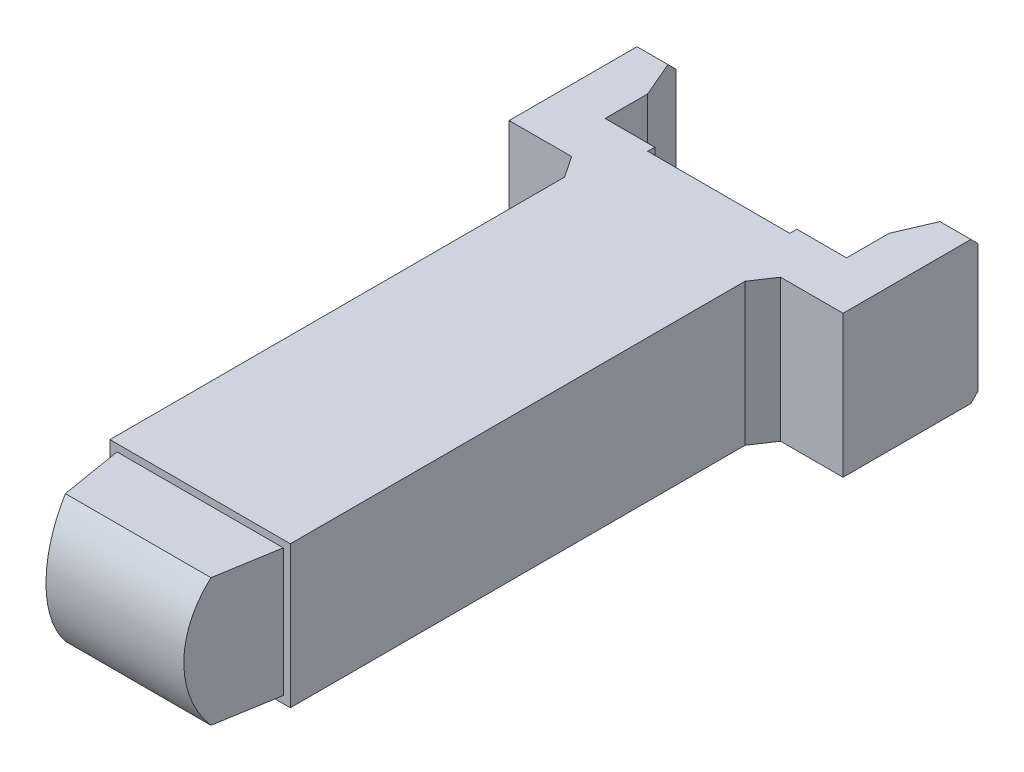
ISO-10303-21;
HEADER;
FILE_DESCRIPTION(('STEP AP214'),'2;1');
FILE_NAME('part.step','',(''),(''),'','','');
FILE_SCHEMA(('AUTOMOTIVE_DESIGN { 1 0 10303 214 1 1 1 1 }'));
ENDSEC;
DATA;
#1=APPLICATION_CONTEXT('core data for automotive mechanical design processes');
#2=APPLICATION_PROTOCOL_DEFINITION('international standard','automotive_design',2000,#1);
#3=PRODUCT_CONTEXT('',#1,'mechanical');
#4=PRODUCT('Part','Part','',(#3));
#5=PRODUCT_RELATED_PRODUCT_CATEGORY('part','',(#4));
#6=PRODUCT_DEFINITION_FORMATION('','',#4);
#7=PRODUCT_DEFINITION_CONTEXT('part definition',#1,'design');
#8=PRODUCT_DEFINITION('design','',#6,#7);
#9=PRODUCT_DEFINITION_SHAPE('','',#8);
#10=(LENGTH_UNIT() NAMED_UNIT(*) SI_UNIT(.MILLI.,.METRE.));
#11=(NAMED_UNIT(*) PLANE_ANGLE_UNIT() SI_UNIT($,.RADIAN.));
#12=(NAMED_UNIT(*) SI_UNIT($,.STERADIAN.) SOLID_ANGLE_UNIT());
#13=UNCERTAINTY_MEASURE_WITH_UNIT(LENGTH_MEASURE(1.E-05),#10,'distance_accuracy_value','');
#14=(GEOMETRIC_REPRESENTATION_CONTEXT(3) GLOBAL_UNCERTAINTY_ASSIGNED_CONTEXT((#13)) GLOBAL_UNIT_ASSIGNED_CONTEXT((#10,
#11,#12)) REPRESENTATION_CONTEXT('',''));
#15=CARTESIAN_POINT('',(0.,0.,0.));
#16=DIRECTION('',(0.,0.,1.));
#17=DIRECTION('',(1.,0.,0.));
#18=AXIS2_PLACEMENT_3D('',#15,#16,#17);
#19=CARTESIAN_POINT('',(-0.635,0.,3.25));
#20=DIRECTION('',(-1.,0.,0.));
#21=DIRECTION('',(0.,0.,1.));
#22=AXIS2_PLACEMENT_3D('',#19,#20,#21);
#23=CYLINDRICAL_SURFACE('',#22,0.7);
#24=CARTESIAN_POINT('',(0.601666666666666,0.,3.25));
#25=DIRECTION('',(0.986393923832144,0.,0.164398987305357));
#26=DIRECTION('',(-0.164398987305357,0.,0.986393923832144));
#27=AXIS2_PLACEMENT_3D('',#24,#25,#26);
#28=ELLIPSE('',#27,0.709655628534792,0.7);
#29=CARTESIAN_POINT('',(0.512301622543637,0.45,3.78619026473818));
#30=VERTEX_POINT('',#29);
#31=CARTESIAN_POINT('',(0.512301622543637,-0.45,3.78619026473818));
#32=VERTEX_POINT('',#31);
#33=EDGE_CURVE('E20',#30,#32,#28,.T.);
#34=ORIENTED_EDGE('',*,*,#33,.F.);
#35=DIRECTION('',(1.,0.,0.));
#36=VECTOR('',#35,1.);
#37=CARTESIAN_POINT('',(-0.635,0.45,3.78619026473818));
#38=LINE('',#37,#36);
#39=CARTESIAN_POINT('',(-0.512301622543637,0.45,3.78619026473818));
#40=VERTEX_POINT('',#39);
#41=EDGE_CURVE('E214',#30,#40,#38,.F.);
#42=ORIENTED_EDGE('',*,*,#41,.T.);
#43=CARTESIAN_POINT('',(-0.601666666666666,0.,3.25));
#44=DIRECTION('',(-0.986393923832144,0.,0.164398987305357));
#45=DIRECTION('',(-0.164398987305357,0.,-0.986393923832144));
#46=AXIS2_PLACEMENT_3D('',#43,#44,#45);
#47=ELLIPSE('',#46,0.709655628534792,0.7);
#48=CARTESIAN_POINT('',(-0.512301622543637,-0.45,3.78619026473818));
#49=VERTEX_POINT('',#48);
#50=EDGE_CURVE('E228',#49,#40,#47,.T.);
#51=ORIENTED_EDGE('',*,*,#50,.F.);
#52=DIRECTION('',(1.,0.,0.));
#53=VECTOR('',#52,1.);
#54=CARTESIAN_POINT('',(-0.635,-0.45,3.78619026473818));
#55=LINE('',#54,#53);
#56=EDGE_CURVE('E216',#49,#32,#55,.T.);
#57=ORIENTED_EDGE('',*,*,#56,.T.);
#58=EDGE_LOOP('',(#34,#42,#51,#57));
#59=FACE_BOUND('',#58,.T.);
#60=ADVANCED_FACE('F17',(#59),#23,.T.);
#61=CARTESIAN_POINT('',(-1.175,-0.5,-1.));
#62=DIRECTION('',(0.,0.,-1.));
#63=DIRECTION('',(-1.,0.,0.));
#64=AXIS2_PLACEMENT_3D('',#61,#62,#63);
#65=PLANE('',#64);
#66=DIRECTION('',(0.,1.,0.));
#67=VECTOR('',#66,1.);
#68=CARTESIAN_POINT('',(-1.125,-0.5,-1.));
#69=LINE('',#68,#67);
#70=CARTESIAN_POINT('',(-1.125,-0.4,-1.));
#71=VERTEX_POINT('',#70);
#72=CARTESIAN_POINT('',(-1.125,0.4,-1.));
#73=VERTEX_POINT('',#72);
#74=EDGE_CURVE('E237',#71,#73,#69,.T.);
#75=ORIENTED_EDGE('',*,*,#74,.T.);
#76=DIRECTION('',(1.,0.,0.));
#77=VECTOR('',#76,1.);
#78=CARTESIAN_POINT('',(-1.175,0.4,-1.));
#79=LINE('',#78,#77);
#80=CARTESIAN_POINT('',(-1.,0.4,-1.));
#81=VERTEX_POINT('',#80);
#82=EDGE_CURVE('E287',#73,#81,#79,.T.);
#83=ORIENTED_EDGE('',*,*,#82,.T.);
#84=DIRECTION('',(0.,1.,0.));
#85=VECTOR('',#84,1.);
#86=CARTESIAN_POINT('',(-1.,-0.5,-1.));
#87=LINE('',#86,#85);
#88=CARTESIAN_POINT('',(-1.,-0.4,-1.));
#89=VERTEX_POINT('',#88);
#90=EDGE_CURVE('E297',#89,#81,#87,.T.);
#91=ORIENTED_EDGE('',*,*,#90,.F.);
#92=DIRECTION('',(1.,0.,0.));
#93=VECTOR('',#92,1.);
#94=CARTESIAN_POINT('',(-1.175,-0.4,-1.));
#95=LINE('',#94,#93);
#96=EDGE_CURVE('E219',#71,#89,#95,.T.);
#97=ORIENTED_EDGE('',*,*,#96,.F.);
#98=EDGE_LOOP('',(#75,#83,#91,#97));
#99=FACE_BOUND('',#98,.T.);
#100=ADVANCED_FACE('F284',(#99),#65,.T.);
#101=CARTESIAN_POINT('',(-1.125,-0.5,-1.));
#102=DIRECTION('',(0.707106781186548,0.,0.707106781186547));
#103=DIRECTION('',(0.707106781186547,0.,-0.707106781186548));
#104=AXIS2_PLACEMENT_3D('',#101,#102,#103);
#105=PLANE('',#104);
#106=DIRECTION('',(0.577350269189625,0.577350269189626,-0.577350269189626));
#107=VECTOR('',#106,1.);
#108=CARTESIAN_POINT('',(-1.175,-0.45,-0.95));
#109=LINE('',#108,#107);
#110=CARTESIAN_POINT('',(-1.175,-0.45,-0.95));
#111=VERTEX_POINT('',#110);
#112=EDGE_CURVE('E277',#111,#71,#109,.T.);
#113=ORIENTED_EDGE('',*,*,#112,.F.);
#114=DIRECTION('',(0.,1.,0.));
#115=VECTOR('',#114,1.);
#116=CARTESIAN_POINT('',(-1.175,-0.5,-0.95));
#117=LINE('',#116,#115);
#118=CARTESIAN_POINT('',(-1.175,0.45,-0.95));
#119=VERTEX_POINT('',#118);
#120=EDGE_CURVE('E294',#119,#111,#117,.F.);
#121=ORIENTED_EDGE('',*,*,#120,.F.);
#122=DIRECTION('',(0.577350269189625,-0.577350269189626,-0.577350269189626));
#123=VECTOR('',#122,1.);
#124=CARTESIAN_POINT('',(-1.175,0.45,-0.95));
#125=LINE('',#124,#123);
#126=EDGE_CURVE('E291',#119,#73,#125,.T.);
#127=ORIENTED_EDGE('',*,*,#126,.T.);
#128=ORIENTED_EDGE('',*,*,#74,.F.);
#129=EDGE_LOOP('',(#113,#121,#127,#128));
#130=FACE_BOUND('',#129,.T.);
#131=ADVANCED_FACE('F292',(#130),#105,.F.);
#132=CARTESIAN_POINT('',(-1.175,-0.4,-1.));
#133=DIRECTION('',(0.,-0.707106781186548,-0.707106781186547));
#134=DIRECTION('',(0.,0.707106781186547,-0.707106781186548));
#135=AXIS2_PLACEMENT_3D('',#132,#133,#134);
#136=PLANE('',#135);
#137=ORIENTED_EDGE('',*,*,#112,.T.);
#138=ORIENTED_EDGE('',*,*,#96,.T.);
#139=DIRECTION('',(-0.290020946713699,0.676715542331965,-0.676715542331964));
#140=VECTOR('',#139,1.);
#141=CARTESIAN_POINT('',(-0.957142857142857,-0.5,-0.9));
#142=LINE('',#141,#140);
#143=CARTESIAN_POINT('',(-0.957142857142857,-0.5,-0.9));
#144=VERTEX_POINT('',#143);
#145=EDGE_CURVE('E308',#144,#89,#142,.T.);
#146=ORIENTED_EDGE('',*,*,#145,.F.);
#147=DIRECTION('',(1.,0.,0.));
#148=VECTOR('',#147,1.);
#149=CARTESIAN_POINT('',(-1.175,-0.5,-0.9));
#150=LINE('',#149,#148);
#151=CARTESIAN_POINT('',(-1.175,-0.5,-0.9));
#152=VERTEX_POINT('',#151);
#153=EDGE_CURVE('E324',#144,#152,#150,.F.);
#154=ORIENTED_EDGE('',*,*,#153,.T.);
#155=DIRECTION('',(0.,-0.707106781186548,0.707106781186547));
#156=VECTOR('',#155,1.);
#157=CARTESIAN_POINT('',(-1.175,-0.45,-0.95));
#158=LINE('',#157,#156);
#159=EDGE_CURVE('E412',#111,#152,#158,.T.);
#160=ORIENTED_EDGE('',*,*,#159,.F.);
#161=EDGE_LOOP('',(#137,#138,#146,#154,#160));
#162=FACE_BOUND('',#161,.T.);
#163=ADVANCED_FACE('F532',(#162),#136,.T.);
#164=CARTESIAN_POINT('',(0.485,-0.5,3.95));
#165=DIRECTION('',(0.986393923832144,0.,0.164398987305357));
#166=DIRECTION('',(0.164398987305357,0.,-0.986393923832144));
#167=AXIS2_PLACEMENT_3D('',#164,#165,#166);
#168=PLANE('',#167);
#169=DIRECTION('',(-0.164398987305357,0.,0.986393923832144));
#170=VECTOR('',#169,1.);
#171=CARTESIAN_POINT('',(0.585,0.45,3.35));
#172=LINE('',#171,#170);
#173=CARTESIAN_POINT('',(0.585,0.45,3.35));
#174=VERTEX_POINT('',#173);
#175=EDGE_CURVE('E221',#174,#30,#172,.T.);
#176=ORIENTED_EDGE('',*,*,#175,.T.);
#177=ORIENTED_EDGE('',*,*,#33,.T.);
#178=DIRECTION('',(0.164398987305357,0.,-0.986393923832144));
#179=VECTOR('',#178,1.);
#180=CARTESIAN_POINT('',(0.512301622543637,-0.45,3.78619026473818));
#181=LINE('',#180,#179);
#182=CARTESIAN_POINT('',(0.585,-0.45,3.35));
#183=VERTEX_POINT('',#182);
#184=EDGE_CURVE('E260',#32,#183,#181,.T.);
#185=ORIENTED_EDGE('',*,*,#184,.T.);
#186=DIRECTION('',(0.,1.,0.));
#187=VECTOR('',#186,1.);
#188=CARTESIAN_POINT('',(0.585,-0.5,3.35));
#189=LINE('',#188,#187);
#190=EDGE_CURVE('E224',#174,#183,#189,.F.);
#191=ORIENTED_EDGE('',*,*,#190,.F.);
#192=EDGE_LOOP('',(#176,#177,#185,#191));
#193=FACE_BOUND('',#192,.T.);
#194=ADVANCED_FACE('F222',(#193),#168,.T.);
#195=CARTESIAN_POINT('',(-0.635,-0.45,3.78619026473818));
#196=DIRECTION('',(0.,1.,0.));
#197=DIRECTION('',(0.,0.,1.));
#198=AXIS2_PLACEMENT_3D('',#195,#196,#197);
#199=PLANE('',#198);
#200=DIRECTION('',(1.,0.,0.));
#201=VECTOR('',#200,1.);
#202=CARTESIAN_POINT('',(0.585,-0.45,3.35));
#203=LINE('',#202,#201);
#204=CARTESIAN_POINT('',(-0.585,-0.45,3.35));
#205=VERTEX_POINT('',#204);
#206=EDGE_CURVE('E250',#183,#205,#203,.F.);
#207=ORIENTED_EDGE('',*,*,#206,.F.);
#208=ORIENTED_EDGE('',*,*,#184,.F.);
#209=ORIENTED_EDGE('',*,*,#56,.F.);
#210=DIRECTION('',(0.164398987305357,0.,0.986393923832144));
#211=VECTOR('',#210,1.);
#212=CARTESIAN_POINT('',(-0.485,-0.45,3.95));
#213=LINE('',#212,#211);
#214=EDGE_CURVE('E266',#205,#49,#213,.T.);
#215=ORIENTED_EDGE('',*,*,#214,.F.);
#216=EDGE_LOOP('',(#207,#208,#209,#215));
#217=FACE_BOUND('',#216,.T.);
#218=ADVANCED_FACE('F780',(#217),#199,.F.);
#219=CARTESIAN_POINT('',(-0.485,-0.5,3.95));
#220=DIRECTION('',(-0.986393923832144,0.,0.164398987305357));
#221=DIRECTION('',(0.164398987305357,0.,0.986393923832144));
#222=AXIS2_PLACEMENT_3D('',#219,#220,#221);
#223=PLANE('',#222);
#224=DIRECTION('',(-0.164398987305357,0.,-0.986393923832144));
#225=VECTOR('',#224,1.);
#226=CARTESIAN_POINT('',(-0.512301622543637,0.45,3.78619026473818));
#227=LINE('',#226,#225);
#228=CARTESIAN_POINT('',(-0.585,0.45,3.35));
#229=VERTEX_POINT('',#228);
#230=EDGE_CURVE('E232',#40,#229,#227,.T.);
#231=ORIENTED_EDGE('',*,*,#230,.T.);
#232=DIRECTION('',(0.,1.,0.));
#233=VECTOR('',#232,1.);
#234=CARTESIAN_POINT('',(-0.585,-0.5,3.35));
#235=LINE('',#234,#233);
#236=EDGE_CURVE('E245',#205,#229,#235,.T.);
#237=ORIENTED_EDGE('',*,*,#236,.F.);
#238=ORIENTED_EDGE('',*,*,#214,.T.);
#239=ORIENTED_EDGE('',*,*,#50,.T.);
#240=EDGE_LOOP('',(#231,#237,#238,#239));
#241=FACE_BOUND('',#240,.T.);
#242=ADVANCED_FACE('F772',(#241),#223,.T.);
#243=CARTESIAN_POINT('',(-0.635,0.45,3.78619026473818));
#244=DIRECTION('',(0.,-1.,0.));
#245=DIRECTION('',(0.,0.,-1.));
#246=AXIS2_PLACEMENT_3D('',#243,#244,#245);
#247=PLANE('',#246);
#248=ORIENTED_EDGE('',*,*,#41,.F.);
#249=ORIENTED_EDGE('',*,*,#175,.F.);
#250=DIRECTION('',(1.,0.,0.));
#251=VECTOR('',#250,1.);
#252=CARTESIAN_POINT('',(0.585,0.45,3.35));
#253=LINE('',#252,#251);
#254=EDGE_CURVE('E242',#229,#174,#253,.T.);
#255=ORIENTED_EDGE('',*,*,#254,.F.);
#256=ORIENTED_EDGE('',*,*,#230,.F.);
#257=EDGE_LOOP('',(#248,#249,#255,#256));
#258=FACE_BOUND('',#257,.T.);
#259=ADVANCED_FACE('F231',(#258),#247,.F.);
#260=CARTESIAN_POINT('',(-1.175,-0.5,0.));
#261=DIRECTION('',(0.,1.,0.));
#262=DIRECTION('',(0.,0.,1.));
#263=AXIS2_PLACEMENT_3D('',#260,#261,#262);
#264=PLANE('',#263);
#265=ORIENTED_EDGE('',*,*,#153,.F.);
#266=DIRECTION('',(-0.393919298579168,0.,-0.919145030018058));
#267=VECTOR('',#266,1.);
#268=CARTESIAN_POINT('',(-0.85,-0.5,-0.65));
#269=LINE('',#268,#267);
#270=CARTESIAN_POINT('',(-0.85,-0.5,-0.65));
#271=VERTEX_POINT('',#270);
#272=EDGE_CURVE('E311',#271,#144,#269,.T.);
#273=ORIENTED_EDGE('',*,*,#272,.F.);
#274=DIRECTION('',(0.,0.,1.));
#275=VECTOR('',#274,1.);
#276=CARTESIAN_POINT('',(-0.85,-0.5,0.));
#277=LINE('',#276,#275);
#278=CARTESIAN_POINT('',(-0.85,-0.5,-0.35));
#279=VERTEX_POINT('',#278);
#280=EDGE_CURVE('E326',#279,#271,#277,.F.);
#281=ORIENTED_EDGE('',*,*,#280,.F.);
#282=DIRECTION('',(1.,0.,0.));
#283=VECTOR('',#282,1.);
#284=CARTESIAN_POINT('',(-1.175,-0.5,-0.35));
#285=LINE('',#284,#283);
#286=CARTESIAN_POINT('',(-0.5,-0.5,-0.35));
#287=VERTEX_POINT('',#286);
#288=EDGE_CURVE('E328',#287,#279,#285,.F.);
#289=ORIENTED_EDGE('',*,*,#288,.F.);
#290=DIRECTION('',(0.,0.,1.));
#291=VECTOR('',#290,1.);
#292=CARTESIAN_POINT('',(-0.5,-0.5,0.));
#293=LINE('',#292,#291);
#294=CARTESIAN_POINT('',(-0.5,-0.5,-0.3));
#295=VERTEX_POINT('',#294);
#296=EDGE_CURVE('E330',#295,#287,#293,.F.);
#297=ORIENTED_EDGE('',*,*,#296,.F.);
#298=DIRECTION('',(1.,0.,0.));
#299=VECTOR('',#298,1.);
#300=CARTESIAN_POINT('',(-1.175,-0.5,-0.3));
#301=LINE('',#300,#299);
#302=CARTESIAN_POINT('',(0.5,-0.5,-0.3));
#303=VERTEX_POINT('',#302);
#304=EDGE_CURVE('E332',#303,#295,#301,.F.);
#305=ORIENTED_EDGE('',*,*,#304,.F.);
#306=DIRECTION('',(0.,0.,1.));
#307=VECTOR('',#306,1.);
#308=CARTESIAN_POINT('',(0.5,-0.5,0.));
#309=LINE('',#308,#307);
#310=CARTESIAN_POINT('',(0.5,-0.5,-0.35));
#311=VERTEX_POINT('',#310);
#312=EDGE_CURVE('E334',#311,#303,#309,.T.);
#313=ORIENTED_EDGE('',*,*,#312,.F.);
#314=DIRECTION('',(1.,0.,0.));
#315=VECTOR('',#314,1.);
#316=CARTESIAN_POINT('',(-1.175,-0.5,-0.35));
#317=LINE('',#316,#315);
#318=CARTESIAN_POINT('',(0.85,-0.5,-0.35));
#319=VERTEX_POINT('',#318);
#320=EDGE_CURVE('E336',#319,#311,#317,.F.);
#321=ORIENTED_EDGE('',*,*,#320,.F.);
#322=DIRECTION('',(0.,0.,1.));
#323=VECTOR('',#322,1.);
#324=CARTESIAN_POINT('',(0.85,-0.5,0.));
#325=LINE('',#324,#323);
#326=CARTESIAN_POINT('',(0.85,-0.5,-0.65));
#327=VERTEX_POINT('',#326);
#328=EDGE_CURVE('E338',#327,#319,#325,.T.);
#329=ORIENTED_EDGE('',*,*,#328,.F.);
#330=DIRECTION('',(-0.393919298579168,0.,0.919145030018058));
#331=VECTOR('',#330,1.);
#332=CARTESIAN_POINT('',(0.957142857142857,-0.5,-0.9));
#333=LINE('',#332,#331);
#334=CARTESIAN_POINT('',(0.957142857142857,-0.5,-0.9));
#335=VERTEX_POINT('',#334);
#336=EDGE_CURVE('E340',#335,#327,#333,.T.);
#337=ORIENTED_EDGE('',*,*,#336,.F.);
#338=DIRECTION('',(1.,0.,0.));
#339=VECTOR('',#338,1.);
#340=CARTESIAN_POINT('',(1.,-0.5,-0.9));
#341=LINE('',#340,#339);
#342=CARTESIAN_POINT('',(1.175,-0.5,-0.9));
#343=VERTEX_POINT('',#342);
#344=EDGE_CURVE('E319',#343,#335,#341,.F.);
#345=ORIENTED_EDGE('',*,*,#344,.F.);
#346=DIRECTION('',(0.,0.,1.));
#347=VECTOR('',#346,1.);
#348=CARTESIAN_POINT('',(1.175,-0.5,0.));
#349=LINE('',#348,#347);
#350=CARTESIAN_POINT('',(1.175,-0.5,0.));
#351=VERTEX_POINT('',#350);
#352=EDGE_CURVE('E342',#351,#343,#349,.F.);
#353=ORIENTED_EDGE('',*,*,#352,.F.);
#354=DIRECTION('',(1.,0.,0.));
#355=VECTOR('',#354,1.);
#356=CARTESIAN_POINT('',(-1.175,-0.5,0.));
#357=LINE('',#356,#355);
#358=CARTESIAN_POINT('',(0.735,-0.5,0.));
#359=VERTEX_POINT('',#358);
#360=EDGE_CURVE('E343',#359,#351,#357,.T.);
#361=ORIENTED_EDGE('',*,*,#360,.F.);
#362=DIRECTION('',(0.554700196225229,0.,-0.832050294337844));
#363=VECTOR('',#362,1.);
#364=CARTESIAN_POINT('',(0.635,-0.5,0.15));
#365=LINE('',#364,#363);
#366=CARTESIAN_POINT('',(0.635,-0.5,0.15));
#367=VERTEX_POINT('',#366);
#368=EDGE_CURVE('E234',#367,#359,#365,.T.);
#369=ORIENTED_EDGE('',*,*,#368,.F.);
#370=DIRECTION('',(0.,0.,-1.));
#371=VECTOR('',#370,1.);
#372=CARTESIAN_POINT('',(0.635,-0.5,3.35));
#373=LINE('',#372,#371);
#374=CARTESIAN_POINT('',(0.635,-0.5,3.35));
#375=VERTEX_POINT('',#374);
#376=EDGE_CURVE('E385',#375,#367,#373,.T.);
#377=ORIENTED_EDGE('',*,*,#376,.F.);
#378=DIRECTION('',(1.,0.,0.));
#379=VECTOR('',#378,1.);
#380=CARTESIAN_POINT('',(0.585,-0.5,3.35));
#381=LINE('',#380,#379);
#382=CARTESIAN_POINT('',(-0.635,-0.5,3.35));
#383=VERTEX_POINT('',#382);
#384=EDGE_CURVE('E256',#383,#375,#381,.T.);
#385=ORIENTED_EDGE('',*,*,#384,.F.);
#386=DIRECTION('',(0.,0.,1.));
#387=VECTOR('',#386,1.);
#388=CARTESIAN_POINT('',(-0.635,-0.5,3.35));
#389=LINE('',#388,#387);
#390=CARTESIAN_POINT('',(-0.635,-0.5,0.15));
#391=VERTEX_POINT('',#390);
#392=EDGE_CURVE('E393',#391,#383,#389,.T.);
#393=ORIENTED_EDGE('',*,*,#392,.F.);
#394=DIRECTION('',(0.55470019622523,0.,0.832050294337843));
#395=VECTOR('',#394,1.);
#396=CARTESIAN_POINT('',(-0.735,-0.5,0.));
#397=LINE('',#396,#395);
#398=CARTESIAN_POINT('',(-0.735,-0.5,0.));
#399=VERTEX_POINT('',#398);
#400=EDGE_CURVE('E398',#399,#391,#397,.T.);
#401=ORIENTED_EDGE('',*,*,#400,.F.);
#402=DIRECTION('',(1.,0.,0.));
#403=VECTOR('',#402,1.);
#404=CARTESIAN_POINT('',(-1.175,-0.5,0.));
#405=LINE('',#404,#403);
#406=CARTESIAN_POINT('',(-1.175,-0.5,0.));
#407=VERTEX_POINT('',#406);
#408=EDGE_CURVE('E403',#407,#399,#405,.T.);
#409=ORIENTED_EDGE('',*,*,#408,.F.);
#410=DIRECTION('',(0.,0.,1.));
#411=VECTOR('',#410,1.);
#412=CARTESIAN_POINT('',(-1.175,-0.5,0.));
#413=LINE('',#412,#411);
#414=EDGE_CURVE('E410',#152,#407,#413,.T.);
#415=ORIENTED_EDGE('',*,*,#414,.F.);
#416=EDGE_LOOP('',(#265,#273,#281,#289,#297,#305,#313,#321,#329,#337,#345,#353,#361,#369,#377,
#385,#393,#401,#409,#415));
#417=FACE_BOUND('',#416,.T.);
#418=ADVANCED_FACE('F365',(#417),#264,.F.);
#419=CARTESIAN_POINT('',(1.175,-0.5,-0.95));
#420=DIRECTION('',(-0.707106781186548,0.,0.707106781186547));
#421=DIRECTION('',(0.707106781186547,0.,0.707106781186548));
#422=AXIS2_PLACEMENT_3D('',#419,#420,#421);
#423=PLANE('',#422);
#424=DIRECTION('',(0.577350269189625,-0.577350269189626,0.577350269189626));
#425=VECTOR('',#424,1.);
#426=CARTESIAN_POINT('',(1.125,-0.4,-1.));
#427=LINE('',#426,#425);
#428=CARTESIAN_POINT('',(1.125,-0.4,-1.));
#429=VERTEX_POINT('',#428);
#430=CARTESIAN_POINT('',(1.175,-0.45,-0.95));
#431=VERTEX_POINT('',#430);
#432=EDGE_CURVE('E314',#429,#431,#427,.T.);
#433=ORIENTED_EDGE('',*,*,#432,.F.);
#434=DIRECTION('',(0.,1.,0.));
#435=VECTOR('',#434,1.);
#436=CARTESIAN_POINT('',(1.125,-0.5,-1.));
#437=LINE('',#436,#435);
#438=CARTESIAN_POINT('',(1.125,0.4,-1.));
#439=VERTEX_POINT('',#438);
#440=EDGE_CURVE('E322',#439,#429,#437,.F.);
#441=ORIENTED_EDGE('',*,*,#440,.F.);
#442=DIRECTION('',(0.577350269189627,0.577350269189625,0.577350269189625));
#443=VECTOR('',#442,1.);
#444=CARTESIAN_POINT('',(1.125,0.4,-1.));
#445=LINE('',#444,#443);
#446=CARTESIAN_POINT('',(1.175,0.45,-0.95));
#447=VERTEX_POINT('',#446);
#448=EDGE_CURVE('E463',#439,#447,#445,.T.);
#449=ORIENTED_EDGE('',*,*,#448,.T.);
#450=DIRECTION('',(0.,1.,0.));
#451=VECTOR('',#450,1.);
#452=CARTESIAN_POINT('',(1.175,-0.5,-0.95));
#453=LINE('',#452,#451);
#454=EDGE_CURVE('E376',#431,#447,#453,.T.);
#455=ORIENTED_EDGE('',*,*,#454,.F.);
#456=EDGE_LOOP('',(#433,#441,#449,#455));
#457=FACE_BOUND('',#456,.T.);
#458=ADVANCED_FACE('F477',(#457),#423,.F.);
#459=CARTESIAN_POINT('',(1.,-0.5,-1.));
#460=DIRECTION('',(0.,0.,-1.));
#461=DIRECTION('',(-1.,0.,0.));
#462=AXIS2_PLACEMENT_3D('',#459,#460,#461);
#463=PLANE('',#462);
#464=DIRECTION('',(0.,1.,0.));
#465=VECTOR('',#464,1.);
#466=CARTESIAN_POINT('',(1.,-0.5,-1.));
#467=LINE('',#466,#465);
#468=CARTESIAN_POINT('',(1.,0.4,-1.));
#469=VERTEX_POINT('',#468);
#470=CARTESIAN_POINT('',(1.,-0.4,-1.));
#471=VERTEX_POINT('',#470);
#472=EDGE_CURVE('E460',#469,#471,#467,.F.);
#473=ORIENTED_EDGE('',*,*,#472,.F.);
#474=DIRECTION('',(1.,0.,0.));
#475=VECTOR('',#474,1.);
#476=CARTESIAN_POINT('',(-1.175,0.4,-1.));
#477=LINE('',#476,#475);
#478=EDGE_CURVE('E378',#469,#439,#477,.T.);
#479=ORIENTED_EDGE('',*,*,#478,.T.);
#480=ORIENTED_EDGE('',*,*,#440,.T.);
#481=DIRECTION('',(1.,0.,0.));
#482=VECTOR('',#481,1.);
#483=CARTESIAN_POINT('',(1.,-0.4,-1.));
#484=LINE('',#483,#482);
#485=EDGE_CURVE('E316',#471,#429,#484,.T.);
#486=ORIENTED_EDGE('',*,*,#485,.F.);
#487=EDGE_LOOP('',(#473,#479,#480,#486));
#488=FACE_BOUND('',#487,.T.);
#489=ADVANCED_FACE('F469',(#488),#463,.T.);
#490=CARTESIAN_POINT('',(1.,-0.4,-1.));
#491=DIRECTION('',(0.,-0.707106781186548,-0.707106781186547));
#492=DIRECTION('',(0.,0.707106781186547,-0.707106781186548));
#493=AXIS2_PLACEMENT_3D('',#490,#491,#492);
#494=PLANE('',#493);
#495=ORIENTED_EDGE('',*,*,#485,.T.);
#496=ORIENTED_EDGE('',*,*,#432,.T.);
#497=DIRECTION('',(0.,0.707106781186548,-0.707106781186547));
#498=VECTOR('',#497,1.);
#499=CARTESIAN_POINT('',(1.175,-0.5,-0.9));
#500=LINE('',#499,#498);
#501=EDGE_CURVE('E362',#343,#431,#500,.T.);
#502=ORIENTED_EDGE('',*,*,#501,.F.);
#503=ORIENTED_EDGE('',*,*,#344,.T.);
#504=DIRECTION('',(-0.290020946713699,-0.676715542331964,0.676715542331965));
#505=VECTOR('',#504,1.);
#506=CARTESIAN_POINT('',(1.,-0.4,-1.));
#507=LINE('',#506,#505);
#508=EDGE_CURVE('E457',#471,#335,#507,.T.);
#509=ORIENTED_EDGE('',*,*,#508,.F.);
#510=EDGE_LOOP('',(#495,#496,#502,#503,#509));
#511=FACE_BOUND('',#510,.T.);
#512=ADVANCED_FACE('F480',(#511),#494,.T.);
#513=CARTESIAN_POINT('',(-0.85,-0.5,-0.65));
#514=DIRECTION('',(0.919145030018058,0.,-0.393919298579168));
#515=DIRECTION('',(-0.393919298579168,0.,-0.919145030018058));
#516=AXIS2_PLACEMENT_3D('',#513,#514,#515);
#517=PLANE('',#516);
#518=DIRECTION('',(-0.393919298579168,0.,-0.919145030018058));
#519=VECTOR('',#518,1.);
#520=CARTESIAN_POINT('',(-0.85,0.5,-0.65));
#521=LINE('',#520,#519);
#522=CARTESIAN_POINT('',(-0.85,0.5,-0.65));
#523=VERTEX_POINT('',#522);
#524=CARTESIAN_POINT('',(-0.957142857142857,0.5,-0.9));
#525=VERTEX_POINT('',#524);
#526=EDGE_CURVE('E423',#523,#525,#521,.T.);
#527=ORIENTED_EDGE('',*,*,#526,.F.);
#528=DIRECTION('',(0.,1.,0.));
#529=VECTOR('',#528,1.);
#530=CARTESIAN_POINT('',(-0.85,-0.5,-0.65));
#531=LINE('',#530,#529);
#532=EDGE_CURVE('E430',#271,#523,#531,.T.);
#533=ORIENTED_EDGE('',*,*,#532,.F.);
#534=ORIENTED_EDGE('',*,*,#272,.T.);
#535=ORIENTED_EDGE('',*,*,#145,.T.);
#536=ORIENTED_EDGE('',*,*,#90,.T.);
#537=DIRECTION('',(0.290020946713701,0.676715542331964,0.676715542331964));
#538=VECTOR('',#537,1.);
#539=CARTESIAN_POINT('',(-1.,0.4,-1.));
#540=LINE('',#539,#538);
#541=EDGE_CURVE('E302',#81,#525,#540,.T.);
#542=ORIENTED_EDGE('',*,*,#541,.T.);
#543=EDGE_LOOP('',(#527,#533,#534,#535,#536,#542));
#544=FACE_BOUND('',#543,.T.);
#545=ADVANCED_FACE('F533',(#544),#517,.T.);
#546=CARTESIAN_POINT('',(-1.175,0.5,-0.9));
#547=DIRECTION('',(0.,-0.707106781186548,0.707106781186548));
#548=DIRECTION('',(0.,-0.707106781186548,-0.707106781186548));
#549=AXIS2_PLACEMENT_3D('',#546,#547,#548);
#550=PLANE('',#549);
#551=ORIENTED_EDGE('',*,*,#82,.F.);
#552=ORIENTED_EDGE('',*,*,#126,.F.);
#553=DIRECTION('',(0.,-0.707106781186547,-0.707106781186547));
#554=VECTOR('',#553,1.);
#555=CARTESIAN_POINT('',(-1.175,0.5,-0.9));
#556=LINE('',#555,#554);
#557=CARTESIAN_POINT('',(-1.175,0.5,-0.9));
#558=VERTEX_POINT('',#557);
#559=EDGE_CURVE('E408',#558,#119,#556,.T.);
#560=ORIENTED_EDGE('',*,*,#559,.F.);
#561=DIRECTION('',(1.,0.,0.));
#562=VECTOR('',#561,1.);
#563=CARTESIAN_POINT('',(-1.175,0.5,-0.9));
#564=LINE('',#563,#562);
#565=EDGE_CURVE('E420',#525,#558,#564,.F.);
#566=ORIENTED_EDGE('',*,*,#565,.F.);
#567=ORIENTED_EDGE('',*,*,#541,.F.);
#568=EDGE_LOOP('',(#551,#552,#560,#566,#567));
#569=FACE_BOUND('',#568,.T.);
#570=ADVANCED_FACE('F300',(#569),#550,.F.);
#571=CARTESIAN_POINT('',(-1.175,-0.5,0.));
#572=DIRECTION('',(-1.,0.,0.));
#573=DIRECTION('',(0.,0.,1.));
#574=AXIS2_PLACEMENT_3D('',#571,#572,#573);
#575=PLANE('',#574);
#576=DIRECTION('',(0.,0.,1.));
#577=VECTOR('',#576,1.);
#578=CARTESIAN_POINT('',(-1.175,0.5,0.));
#579=LINE('',#578,#577);
#580=CARTESIAN_POINT('',(-1.175,0.5,0.));
#581=VERTEX_POINT('',#580);
#582=EDGE_CURVE('E418',#558,#581,#579,.T.);
#583=ORIENTED_EDGE('',*,*,#582,.F.);
#584=ORIENTED_EDGE('',*,*,#559,.T.);
#585=ORIENTED_EDGE('',*,*,#120,.T.);
#586=ORIENTED_EDGE('',*,*,#159,.T.);
#587=ORIENTED_EDGE('',*,*,#414,.T.);
#588=DIRECTION('',(0.,1.,0.));
#589=VECTOR('',#588,1.);
#590=CARTESIAN_POINT('',(-1.175,-0.5,0.));
#591=LINE('',#590,#589);
#592=EDGE_CURVE('E405',#581,#407,#591,.F.);
#593=ORIENTED_EDGE('',*,*,#592,.F.);
#594=EDGE_LOOP('',(#583,#584,#585,#586,#587,#593));
#595=FACE_BOUND('',#594,.T.);
#596=ADVANCED_FACE('F416',(#595),#575,.T.);
#597=CARTESIAN_POINT('',(-1.175,-0.5,0.));
#598=DIRECTION('',(0.,0.,1.));
#599=DIRECTION('',(1.,0.,0.));
#600=AXIS2_PLACEMENT_3D('',#597,#598,#599);
#601=PLANE('',#600);
#602=ORIENTED_EDGE('',*,*,#408,.T.);
#603=DIRECTION('',(0.,1.,0.));
#604=VECTOR('',#603,1.);
#605=CARTESIAN_POINT('',(-0.735,-0.5,0.));
#606=LINE('',#605,#604);
#607=CARTESIAN_POINT('',(-0.735,0.5,0.));
#608=VERTEX_POINT('',#607);
#609=EDGE_CURVE('E400',#608,#399,#606,.F.);
#610=ORIENTED_EDGE('',*,*,#609,.F.);
#611=DIRECTION('',(1.,0.,0.));
#612=VECTOR('',#611,1.);
#613=CARTESIAN_POINT('',(-1.175,0.5,0.));
#614=LINE('',#613,#612);
#615=EDGE_CURVE('E507',#581,#608,#614,.T.);
#616=ORIENTED_EDGE('',*,*,#615,.F.);
#617=ORIENTED_EDGE('',*,*,#592,.T.);
#618=EDGE_LOOP('',(#602,#610,#616,#617));
#619=FACE_BOUND('',#618,.T.);
#620=ADVANCED_FACE('F512',(#619),#601,.T.);
#621=CARTESIAN_POINT('',(-0.735,-0.5,0.));
#622=DIRECTION('',(-0.832050294337843,0.,0.55470019622523));
#623=DIRECTION('',(0.55470019622523,0.,0.832050294337843));
#624=AXIS2_PLACEMENT_3D('',#621,#622,#623);
#625=PLANE('',#624);
#626=ORIENTED_EDGE('',*,*,#400,.T.);
#627=DIRECTION('',(0.,1.,0.));
#628=VECTOR('',#627,1.);
#629=CARTESIAN_POINT('',(-0.635,-0.5,0.15));
#630=LINE('',#629,#628);
#631=CARTESIAN_POINT('',(-0.635,0.5,0.15));
#632=VERTEX_POINT('',#631);
#633=EDGE_CURVE('E395',#632,#391,#630,.F.);
#634=ORIENTED_EDGE('',*,*,#633,.F.);
#635=DIRECTION('',(0.554700196225229,0.,0.832050294337844));
#636=VECTOR('',#635,1.);
#637=CARTESIAN_POINT('',(-0.735,0.5,0.));
#638=LINE('',#637,#636);
#639=EDGE_CURVE('E504',#608,#632,#638,.T.);
#640=ORIENTED_EDGE('',*,*,#639,.F.);
#641=ORIENTED_EDGE('',*,*,#609,.T.);
#642=EDGE_LOOP('',(#626,#634,#640,#641));
#643=FACE_BOUND('',#642,.T.);
#644=ADVANCED_FACE('F516',(#643),#625,.T.);
#645=CARTESIAN_POINT('',(-0.635,-0.5,3.35));
#646=DIRECTION('',(-1.,0.,0.));
#647=DIRECTION('',(0.,0.,1.));
#648=AXIS2_PLACEMENT_3D('',#645,#646,#647);
#649=PLANE('',#648);
#650=ORIENTED_EDGE('',*,*,#392,.T.);
#651=DIRECTION('',(0.,1.,0.));
#652=VECTOR('',#651,1.);
#653=CARTESIAN_POINT('',(-0.635,-0.5,3.35));
#654=LINE('',#653,#652);
#655=CARTESIAN_POINT('',(-0.635,0.5,3.35));
#656=VERTEX_POINT('',#655);
#657=EDGE_CURVE('E390',#656,#383,#654,.F.);
#658=ORIENTED_EDGE('',*,*,#657,.F.);
#659=DIRECTION('',(0.,0.,1.));
#660=VECTOR('',#659,1.);
#661=CARTESIAN_POINT('',(-0.635,0.5,0.));
#662=LINE('',#661,#660);
#663=EDGE_CURVE('E501',#632,#656,#662,.T.);
#664=ORIENTED_EDGE('',*,*,#663,.F.);
#665=ORIENTED_EDGE('',*,*,#633,.T.);
#666=EDGE_LOOP('',(#650,#658,#664,#665));
#667=FACE_BOUND('',#666,.T.);
#668=ADVANCED_FACE('F520',(#667),#649,.T.);
#669=CARTESIAN_POINT('',(0.585,-0.5,3.35));
#670=DIRECTION('',(0.,0.,1.));
#671=DIRECTION('',(1.,0.,0.));
#672=AXIS2_PLACEMENT_3D('',#669,#670,#671);
#673=PLANE('',#672);
#674=ORIENTED_EDGE('',*,*,#236,.T.);
#675=ORIENTED_EDGE('',*,*,#254,.T.);
#676=ORIENTED_EDGE('',*,*,#190,.T.);
#677=ORIENTED_EDGE('',*,*,#206,.T.);
#678=EDGE_LOOP('',(#674,#675,#676,#677));
#679=FACE_BOUND('',#678,.T.);
#680=ORIENTED_EDGE('',*,*,#384,.T.);
#681=DIRECTION('',(0.,1.,0.));
#682=VECTOR('',#681,1.);
#683=CARTESIAN_POINT('',(0.635,-0.5,3.35));
#684=LINE('',#683,#682);
#685=CARTESIAN_POINT('',(0.635,0.5,3.35));
#686=VERTEX_POINT('',#685);
#687=EDGE_CURVE('E244',#686,#375,#684,.F.);
#688=ORIENTED_EDGE('',*,*,#687,.F.);
#689=DIRECTION('',(1.,0.,0.));
#690=VECTOR('',#689,1.);
#691=CARTESIAN_POINT('',(-1.175,0.5,3.35));
#692=LINE('',#691,#690);
#693=EDGE_CURVE('E498',#656,#686,#692,.T.);
#694=ORIENTED_EDGE('',*,*,#693,.F.);
#695=ORIENTED_EDGE('',*,*,#657,.T.);
#696=EDGE_LOOP('',(#680,#688,#694,#695));
#697=FACE_BOUND('',#696,.T.);
#698=ADVANCED_FACE('F524',(#679,#697),#673,.T.);
#699=CARTESIAN_POINT('',(0.635,-0.5,3.35));
#700=DIRECTION('',(1.,0.,0.));
#701=DIRECTION('',(0.,0.,-1.));
#702=AXIS2_PLACEMENT_3D('',#699,#700,#701);
#703=PLANE('',#702);
#704=ORIENTED_EDGE('',*,*,#376,.T.);
#705=DIRECTION('',(0.,1.,0.));
#706=VECTOR('',#705,1.);
#707=CARTESIAN_POINT('',(0.635,-0.5,0.15));
#708=LINE('',#707,#706);
#709=CARTESIAN_POINT('',(0.635,0.5,0.15));
#710=VERTEX_POINT('',#709);
#711=EDGE_CURVE('E354',#710,#367,#708,.F.);
#712=ORIENTED_EDGE('',*,*,#711,.F.);
#713=DIRECTION('',(0.,0.,1.));
#714=VECTOR('',#713,1.);
#715=CARTESIAN_POINT('',(0.635,0.5,0.));
#716=LINE('',#715,#714);
#717=EDGE_CURVE('E495',#686,#710,#716,.F.);
#718=ORIENTED_EDGE('',*,*,#717,.F.);
#719=ORIENTED_EDGE('',*,*,#687,.T.);
#720=EDGE_LOOP('',(#704,#712,#718,#719));
#721=FACE_BOUND('',#720,.T.);
#722=ADVANCED_FACE('F527',(#721),#703,.T.);
#723=CARTESIAN_POINT('',(0.735,-0.5,0.));
#724=DIRECTION('',(0.832050294337844,0.,0.554700196225229));
#725=DIRECTION('',(0.554700196225229,0.,-0.832050294337844));
#726=AXIS2_PLACEMENT_3D('',#723,#724,#725);
#727=PLANE('',#726);
#728=ORIENTED_EDGE('',*,*,#368,.T.);
#729=DIRECTION('',(0.,1.,0.));
#730=VECTOR('',#729,1.);
#731=CARTESIAN_POINT('',(0.735,-0.5,0.));
#732=LINE('',#731,#730);
#733=CARTESIAN_POINT('',(0.735,0.5,0.));
#734=VERTEX_POINT('',#733);
#735=EDGE_CURVE('E352',#734,#359,#732,.F.);
#736=ORIENTED_EDGE('',*,*,#735,.F.);
#737=DIRECTION('',(0.554700196225229,0.,-0.832050294337844));
#738=VECTOR('',#737,1.);
#739=CARTESIAN_POINT('',(0.635,0.5,0.15));
#740=LINE('',#739,#738);
#741=EDGE_CURVE('E490',#710,#734,#740,.T.);
#742=ORIENTED_EDGE('',*,*,#741,.F.);
#743=ORIENTED_EDGE('',*,*,#711,.T.);
#744=EDGE_LOOP('',(#728,#736,#742,#743));
#745=FACE_BOUND('',#744,.T.);
#746=ADVANCED_FACE('F350',(#745),#727,.T.);
#747=CARTESIAN_POINT('',(0.735,-0.5,0.));
#748=DIRECTION('',(0.,0.,1.));
#749=DIRECTION('',(1.,0.,0.));
#750=AXIS2_PLACEMENT_3D('',#747,#748,#749);
#751=PLANE('',#750);
#752=ORIENTED_EDGE('',*,*,#360,.T.);
#753=DIRECTION('',(0.,1.,0.));
#754=VECTOR('',#753,1.);
#755=CARTESIAN_POINT('',(1.175,-0.5,0.));
#756=LINE('',#755,#754);
#757=CARTESIAN_POINT('',(1.175,0.5,0.));
#758=VERTEX_POINT('',#757);
#759=EDGE_CURVE('E372',#758,#351,#756,.F.);
#760=ORIENTED_EDGE('',*,*,#759,.F.);
#761=DIRECTION('',(1.,0.,0.));
#762=VECTOR('',#761,1.);
#763=CARTESIAN_POINT('',(-1.175,0.5,0.));
#764=LINE('',#763,#762);
#765=EDGE_CURVE('E360',#734,#758,#764,.T.);
#766=ORIENTED_EDGE('',*,*,#765,.F.);
#767=ORIENTED_EDGE('',*,*,#735,.T.);
#768=EDGE_LOOP('',(#752,#760,#766,#767));
#769=FACE_BOUND('',#768,.T.);
#770=ADVANCED_FACE('F358',(#769),#751,.T.);
#771=CARTESIAN_POINT('',(1.175,-0.5,0.));
#772=DIRECTION('',(1.,0.,0.));
#773=DIRECTION('',(0.,0.,-1.));
#774=AXIS2_PLACEMENT_3D('',#771,#772,#773);
#775=PLANE('',#774);
#776=DIRECTION('',(0.,0.,1.));
#777=VECTOR('',#776,1.);
#778=CARTESIAN_POINT('',(1.175,0.5,0.));
#779=LINE('',#778,#777);
#780=CARTESIAN_POINT('',(1.175,0.5,-0.9));
#781=VERTEX_POINT('',#780);
#782=EDGE_CURVE('E374',#758,#781,#779,.F.);
#783=ORIENTED_EDGE('',*,*,#782,.F.);
#784=ORIENTED_EDGE('',*,*,#759,.T.);
#785=ORIENTED_EDGE('',*,*,#352,.T.);
#786=ORIENTED_EDGE('',*,*,#501,.T.);
#787=ORIENTED_EDGE('',*,*,#454,.T.);
#788=DIRECTION('',(0.,-0.707106781186548,-0.707106781186548));
#789=VECTOR('',#788,1.);
#790=CARTESIAN_POINT('',(1.175,0.5,-0.9));
#791=LINE('',#790,#789);
#792=EDGE_CURVE('E375',#447,#781,#791,.F.);
#793=ORIENTED_EDGE('',*,*,#792,.T.);
#794=EDGE_LOOP('',(#783,#784,#785,#786,#787,#793));
#795=FACE_BOUND('',#794,.T.);
#796=ADVANCED_FACE('F371',(#795),#775,.T.);
#797=CARTESIAN_POINT('',(-1.175,0.5,-0.9));
#798=DIRECTION('',(0.,-0.707106781186548,0.707106781186548));
#799=DIRECTION('',(0.,-0.707106781186548,-0.707106781186548));
#800=AXIS2_PLACEMENT_3D('',#797,#798,#799);
#801=PLANE('',#800);
#802=ORIENTED_EDGE('',*,*,#478,.F.);
#803=DIRECTION('',(0.290020946713699,-0.676715542331964,-0.676715542331965));
#804=VECTOR('',#803,1.);
#805=CARTESIAN_POINT('',(0.957142857142857,0.5,-0.9));
#806=LINE('',#805,#804);
#807=CARTESIAN_POINT('',(0.957142857142858,0.5,-0.9));
#808=VERTEX_POINT('',#807);
#809=EDGE_CURVE('E454',#808,#469,#806,.T.);
#810=ORIENTED_EDGE('',*,*,#809,.F.);
#811=DIRECTION('',(1.,0.,0.));
#812=VECTOR('',#811,1.);
#813=CARTESIAN_POINT('',(-1.175,0.5,-0.9));
#814=LINE('',#813,#812);
#815=EDGE_CURVE('E487',#781,#808,#814,.F.);
#816=ORIENTED_EDGE('',*,*,#815,.F.);
#817=ORIENTED_EDGE('',*,*,#792,.F.);
#818=ORIENTED_EDGE('',*,*,#448,.F.);
#819=EDGE_LOOP('',(#802,#810,#816,#817,#818));
#820=FACE_BOUND('',#819,.T.);
#821=ADVANCED_FACE('F473',(#820),#801,.F.);
#822=CARTESIAN_POINT('',(0.85,-0.5,-0.65));
#823=DIRECTION('',(-0.919145030018058,0.,-0.393919298579167));
#824=DIRECTION('',(-0.393919298579167,0.,0.919145030018058));
#825=AXIS2_PLACEMENT_3D('',#822,#823,#824);
#826=PLANE('',#825);
#827=DIRECTION('',(-0.393919298579168,0.,0.919145030018058));
#828=VECTOR('',#827,1.);
#829=CARTESIAN_POINT('',(0.957142857142857,0.5,-0.9));
#830=LINE('',#829,#828);
#831=CARTESIAN_POINT('',(0.85,0.5,-0.65));
#832=VERTEX_POINT('',#831);
#833=EDGE_CURVE('E485',#808,#832,#830,.T.);
#834=ORIENTED_EDGE('',*,*,#833,.F.);
#835=ORIENTED_EDGE('',*,*,#809,.T.);
#836=ORIENTED_EDGE('',*,*,#472,.T.);
#837=ORIENTED_EDGE('',*,*,#508,.T.);
#838=ORIENTED_EDGE('',*,*,#336,.T.);
#839=DIRECTION('',(0.,1.,0.));
#840=VECTOR('',#839,1.);
#841=CARTESIAN_POINT('',(0.85,-0.5,-0.65));
#842=LINE('',#841,#840);
#843=EDGE_CURVE('E451',#832,#327,#842,.F.);
#844=ORIENTED_EDGE('',*,*,#843,.F.);
#845=EDGE_LOOP('',(#834,#835,#836,#837,#838,#844));
#846=FACE_BOUND('',#845,.T.);
#847=ADVANCED_FACE('F483',(#846),#826,.T.);
#848=CARTESIAN_POINT('',(0.85,-0.5,-0.35));
#849=DIRECTION('',(-1.,0.,0.));
#850=DIRECTION('',(0.,0.,1.));
#851=AXIS2_PLACEMENT_3D('',#848,#849,#850);
#852=PLANE('',#851);
#853=ORIENTED_EDGE('',*,*,#328,.T.);
#854=DIRECTION('',(0.,1.,0.));
#855=VECTOR('',#854,1.);
#856=CARTESIAN_POINT('',(0.85,-0.5,-0.35));
#857=LINE('',#856,#855);
#858=CARTESIAN_POINT('',(0.85,0.5,-0.35));
#859=VERTEX_POINT('',#858);
#860=EDGE_CURVE('E448',#859,#319,#857,.F.);
#861=ORIENTED_EDGE('',*,*,#860,.F.);
#862=DIRECTION('',(0.,0.,1.));
#863=VECTOR('',#862,1.);
#864=CARTESIAN_POINT('',(0.85,0.5,0.));
#865=LINE('',#864,#863);
#866=EDGE_CURVE('E567',#832,#859,#865,.T.);
#867=ORIENTED_EDGE('',*,*,#866,.F.);
#868=ORIENTED_EDGE('',*,*,#843,.T.);
#869=EDGE_LOOP('',(#853,#861,#867,#868));
#870=FACE_BOUND('',#869,.T.);
#871=ADVANCED_FACE('F566',(#870),#852,.T.);
#872=CARTESIAN_POINT('',(0.5,-0.5,-0.35));
#873=DIRECTION('',(0.,0.,-1.));
#874=DIRECTION('',(-1.,0.,0.));
#875=AXIS2_PLACEMENT_3D('',#872,#873,#874);
#876=PLANE('',#875);
#877=ORIENTED_EDGE('',*,*,#320,.T.);
#878=DIRECTION('',(0.,1.,0.));
#879=VECTOR('',#878,1.);
#880=CARTESIAN_POINT('',(0.5,-0.5,-0.35));
#881=LINE('',#880,#879);
#882=CARTESIAN_POINT('',(0.5,0.5,-0.35));
#883=VERTEX_POINT('',#882);
#884=EDGE_CURVE('E445',#883,#311,#881,.F.);
#885=ORIENTED_EDGE('',*,*,#884,.F.);
#886=DIRECTION('',(1.,0.,0.));
#887=VECTOR('',#886,1.);
#888=CARTESIAN_POINT('',(-1.175,0.5,-0.35));
#889=LINE('',#888,#887);
#890=EDGE_CURVE('E562',#859,#883,#889,.F.);
#891=ORIENTED_EDGE('',*,*,#890,.F.);
#892=ORIENTED_EDGE('',*,*,#860,.T.);
#893=EDGE_LOOP('',(#877,#885,#891,#892));
#894=FACE_BOUND('',#893,.T.);
#895=ADVANCED_FACE('F561',(#894),#876,.T.);
#896=CARTESIAN_POINT('',(0.5,-0.5,-0.3));
#897=DIRECTION('',(-1.,0.,0.));
#898=DIRECTION('',(0.,0.,1.));
#899=AXIS2_PLACEMENT_3D('',#896,#897,#898);
#900=PLANE('',#899);
#901=ORIENTED_EDGE('',*,*,#312,.T.);
#902=DIRECTION('',(0.,1.,0.));
#903=VECTOR('',#902,1.);
#904=CARTESIAN_POINT('',(0.5,-0.5,-0.3));
#905=LINE('',#904,#903);
#906=CARTESIAN_POINT('',(0.5,0.5,-0.3));
#907=VERTEX_POINT('',#906);
#908=EDGE_CURVE('E442',#907,#303,#905,.F.);
#909=ORIENTED_EDGE('',*,*,#908,.F.);
#910=DIRECTION('',(0.,0.,1.));
#911=VECTOR('',#910,1.);
#912=CARTESIAN_POINT('',(0.5,0.5,0.));
#913=LINE('',#912,#911);
#914=EDGE_CURVE('E557',#883,#907,#913,.T.);
#915=ORIENTED_EDGE('',*,*,#914,.F.);
#916=ORIENTED_EDGE('',*,*,#884,.T.);
#917=EDGE_LOOP('',(#901,#909,#915,#916));
#918=FACE_BOUND('',#917,.T.);
#919=ADVANCED_FACE('F555',(#918),#900,.T.);
#920=CARTESIAN_POINT('',(-0.5,-0.5,-0.3));
#921=DIRECTION('',(0.,0.,-1.));
#922=DIRECTION('',(-1.,0.,0.));
#923=AXIS2_PLACEMENT_3D('',#920,#921,#922);
#924=PLANE('',#923);
#925=ORIENTED_EDGE('',*,*,#304,.T.);
#926=DIRECTION('',(0.,1.,0.));
#927=VECTOR('',#926,1.);
#928=CARTESIAN_POINT('',(-0.5,-0.5,-0.3));
#929=LINE('',#928,#927);
#930=CARTESIAN_POINT('',(-0.5,0.5,-0.3));
#931=VERTEX_POINT('',#930);
#932=EDGE_CURVE('E439',#931,#295,#929,.F.);
#933=ORIENTED_EDGE('',*,*,#932,.F.);
#934=DIRECTION('',(1.,0.,0.));
#935=VECTOR('',#934,1.);
#936=CARTESIAN_POINT('',(-1.175,0.5,-0.3));
#937=LINE('',#936,#935);
#938=EDGE_CURVE('E549',#907,#931,#937,.F.);
#939=ORIENTED_EDGE('',*,*,#938,.F.);
#940=ORIENTED_EDGE('',*,*,#908,.T.);
#941=EDGE_LOOP('',(#925,#933,#939,#940));
#942=FACE_BOUND('',#941,.T.);
#943=ADVANCED_FACE('F548',(#942),#924,.T.);
#944=CARTESIAN_POINT('',(-0.5,-0.5,-0.3));
#945=DIRECTION('',(1.,0.,0.));
#946=DIRECTION('',(0.,0.,-1.));
#947=AXIS2_PLACEMENT_3D('',#944,#945,#946);
#948=PLANE('',#947);
#949=ORIENTED_EDGE('',*,*,#296,.T.);
#950=DIRECTION('',(0.,1.,0.));
#951=VECTOR('',#950,1.);
#952=CARTESIAN_POINT('',(-0.5,-0.5,-0.35));
#953=LINE('',#952,#951);
#954=CARTESIAN_POINT('',(-0.5,0.5,-0.35));
#955=VERTEX_POINT('',#954);
#956=EDGE_CURVE('E436',#955,#287,#953,.F.);
#957=ORIENTED_EDGE('',*,*,#956,.F.);
#958=DIRECTION('',(0.,0.,1.));
#959=VECTOR('',#958,1.);
#960=CARTESIAN_POINT('',(-0.5,0.5,0.));
#961=LINE('',#960,#959);
#962=EDGE_CURVE('E544',#931,#955,#961,.F.);
#963=ORIENTED_EDGE('',*,*,#962,.F.);
#964=ORIENTED_EDGE('',*,*,#932,.T.);
#965=EDGE_LOOP('',(#949,#957,#963,#964));
#966=FACE_BOUND('',#965,.T.);
#967=ADVANCED_FACE('F543',(#966),#948,.T.);
#968=CARTESIAN_POINT('',(-0.85,-0.5,-0.35));
#969=DIRECTION('',(0.,0.,-1.));
#970=DIRECTION('',(-1.,0.,0.));
#971=AXIS2_PLACEMENT_3D('',#968,#969,#970);
#972=PLANE('',#971);
#973=ORIENTED_EDGE('',*,*,#288,.T.);
#974=DIRECTION('',(0.,1.,0.));
#975=VECTOR('',#974,1.);
#976=CARTESIAN_POINT('',(-0.85,-0.5,-0.35));
#977=LINE('',#976,#975);
#978=CARTESIAN_POINT('',(-0.85,0.5,-0.35));
#979=VERTEX_POINT('',#978);
#980=EDGE_CURVE('E35',#979,#279,#977,.F.);
#981=ORIENTED_EDGE('',*,*,#980,.F.);
#982=DIRECTION('',(1.,0.,0.));
#983=VECTOR('',#982,1.);
#984=CARTESIAN_POINT('',(-1.175,0.5,-0.35));
#985=LINE('',#984,#983);
#986=EDGE_CURVE('E26',#955,#979,#985,.F.);
#987=ORIENTED_EDGE('',*,*,#986,.F.);
#988=ORIENTED_EDGE('',*,*,#956,.T.);
#989=EDGE_LOOP('',(#973,#981,#987,#988));
#990=FACE_BOUND('',#989,.T.);
#991=ADVANCED_FACE('F539',(#990),#972,.T.);
#992=CARTESIAN_POINT('',(-0.85,-0.5,-0.35));
#993=DIRECTION('',(1.,0.,0.));
#994=DIRECTION('',(0.,0.,-1.));
#995=AXIS2_PLACEMENT_3D('',#992,#993,#994);
#996=PLANE('',#995);
#997=ORIENTED_EDGE('',*,*,#280,.T.);
#998=ORIENTED_EDGE('',*,*,#532,.T.);
#999=DIRECTION('',(0.,0.,1.));
#1000=VECTOR('',#999,1.);
#1001=CARTESIAN_POINT('',(-0.85,0.5,0.));
#1002=LINE('',#1001,#1000);
#1003=EDGE_CURVE('E11',#979,#523,#1002,.F.);
#1004=ORIENTED_EDGE('',*,*,#1003,.F.);
#1005=ORIENTED_EDGE('',*,*,#980,.T.);
#1006=EDGE_LOOP('',(#997,#998,#1004,#1005));
#1007=FACE_BOUND('',#1006,.T.);
#1008=ADVANCED_FACE('F535',(#1007),#996,.T.);
#1009=CARTESIAN_POINT('',(-1.175,0.5,0.));
#1010=DIRECTION('',(0.,1.,0.));
#1011=DIRECTION('',(0.,0.,1.));
#1012=AXIS2_PLACEMENT_3D('',#1009,#1010,#1011);
#1013=PLANE('',#1012);
#1014=ORIENTED_EDGE('',*,*,#986,.T.);
#1015=ORIENTED_EDGE('',*,*,#1003,.T.);
#1016=ORIENTED_EDGE('',*,*,#526,.T.);
#1017=ORIENTED_EDGE('',*,*,#565,.T.);
#1018=ORIENTED_EDGE('',*,*,#582,.T.);
#1019=ORIENTED_EDGE('',*,*,#615,.T.);
#1020=ORIENTED_EDGE('',*,*,#639,.T.);
#1021=ORIENTED_EDGE('',*,*,#663,.T.);
#1022=ORIENTED_EDGE('',*,*,#693,.T.);
#1023=ORIENTED_EDGE('',*,*,#717,.T.);
#1024=ORIENTED_EDGE('',*,*,#741,.T.);
#1025=ORIENTED_EDGE('',*,*,#765,.T.);
#1026=ORIENTED_EDGE('',*,*,#782,.T.);
#1027=ORIENTED_EDGE('',*,*,#815,.T.);
#1028=ORIENTED_EDGE('',*,*,#833,.T.);
#1029=ORIENTED_EDGE('',*,*,#866,.T.);
#1030=ORIENTED_EDGE('',*,*,#890,.T.);
#1031=ORIENTED_EDGE('',*,*,#914,.T.);
#1032=ORIENTED_EDGE('',*,*,#938,.T.);
#1033=ORIENTED_EDGE('',*,*,#962,.T.);
#1034=EDGE_LOOP('',(#1014,#1015,#1016,#1017,#1018,#1019,#1020,#1021,#1022,#1023,#1024,#1025,
#1026,#1027,#1028,#1029,#1030,#1031,#1032,#1033));
#1035=FACE_BOUND('',#1034,.T.);
#1036=ADVANCED_FACE('F426',(#1035),#1013,.T.);
#1037=CLOSED_SHELL('',(#60,#100,#131,#163,#194,#218,#242,#259,#418,#458,#489,#512,#545,#570,
#596,#620,#644,#668,#698,#722,#746,#770,#796,#821,#847,#871,#895,#919,#943,#967,#991,#1008,#1036));
#1038=MANIFOLD_SOLID_BREP('B1',#1037);
#1039=ADVANCED_BREP_SHAPE_REPRESENTATION('',(#18,#1038),#14);
#1040=SHAPE_DEFINITION_REPRESENTATION(#9,#1039);
ENDSEC;
END-ISO-10303-21;
